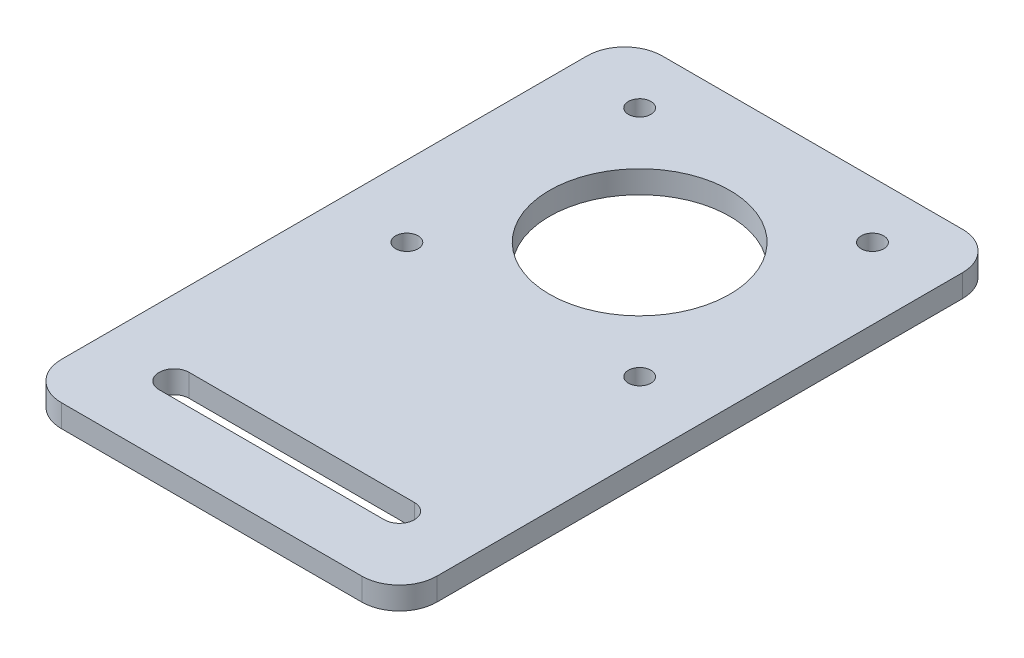
ISO-10303-21;
HEADER;
FILE_DESCRIPTION(('STEP AP214'),'2;1');
FILE_NAME('part.step','',(''),(''),'','','');
FILE_SCHEMA(('AUTOMOTIVE_DESIGN { 1 0 10303 214 1 1 1 1 }'));
ENDSEC;
DATA;
#1=APPLICATION_CONTEXT('core data for automotive mechanical design processes');
#2=APPLICATION_PROTOCOL_DEFINITION('international standard','automotive_design',2000,#1);
#3=PRODUCT_CONTEXT('',#1,'mechanical');
#4=PRODUCT('Part','Part','',(#3));
#5=PRODUCT_RELATED_PRODUCT_CATEGORY('part','',(#4));
#6=PRODUCT_DEFINITION_FORMATION('','',#4);
#7=PRODUCT_DEFINITION_CONTEXT('part definition',#1,'design');
#8=PRODUCT_DEFINITION('design','',#6,#7);
#9=PRODUCT_DEFINITION_SHAPE('','',#8);
#10=(LENGTH_UNIT() NAMED_UNIT(*) SI_UNIT(.MILLI.,.METRE.));
#11=(NAMED_UNIT(*) PLANE_ANGLE_UNIT() SI_UNIT($,.RADIAN.));
#12=(NAMED_UNIT(*) SI_UNIT($,.STERADIAN.) SOLID_ANGLE_UNIT());
#13=UNCERTAINTY_MEASURE_WITH_UNIT(LENGTH_MEASURE(1.E-05),#10,'distance_accuracy_value','');
#14=(GEOMETRIC_REPRESENTATION_CONTEXT(3) GLOBAL_UNCERTAINTY_ASSIGNED_CONTEXT((#13)) GLOBAL_UNIT_ASSIGNED_CONTEXT((#10,
#11,#12)) REPRESENTATION_CONTEXT('',''));
#15=CARTESIAN_POINT('',(0.,0.,0.));
#16=DIRECTION('',(0.,0.,1.));
#17=DIRECTION('',(1.,0.,0.));
#18=AXIS2_PLACEMENT_3D('',#15,#16,#17);
#19=CARTESIAN_POINT('',(-25.,3.,-40.));
#20=DIRECTION('',(1.,0.,0.));
#21=DIRECTION('',(0.,0.,-1.));
#22=AXIS2_PLACEMENT_3D('',#19,#20,#21);
#23=PLANE('',#22);
#24=DIRECTION('',(0.,0.,1.));
#25=VECTOR('',#24,1.);
#26=CARTESIAN_POINT('',(-25.,0.,-40.));
#27=LINE('',#26,#25);
#28=CARTESIAN_POINT('',(-25.,0.,-35.));
#29=VERTEX_POINT('',#28);
#30=CARTESIAN_POINT('',(-25.,0.,35.));
#31=VERTEX_POINT('',#30);
#32=EDGE_CURVE('E163',#29,#31,#27,.T.);
#33=ORIENTED_EDGE('',*,*,#32,.T.);
#34=DIRECTION('',(0.,-1.,0.));
#35=VECTOR('',#34,1.);
#36=CARTESIAN_POINT('',(-25.,3.,35.));
#37=LINE('',#36,#35);
#38=CARTESIAN_POINT('',(-25.,3.,35.));
#39=VERTEX_POINT('',#38);
#40=EDGE_CURVE('E244',#31,#39,#37,.F.);
#41=ORIENTED_EDGE('',*,*,#40,.T.);
#42=DIRECTION('',(0.,0.,1.));
#43=VECTOR('',#42,1.);
#44=CARTESIAN_POINT('',(-25.,3.,-40.));
#45=LINE('',#44,#43);
#46=CARTESIAN_POINT('',(-25.,3.,-35.));
#47=VERTEX_POINT('',#46);
#48=EDGE_CURVE('E196',#47,#39,#45,.T.);
#49=ORIENTED_EDGE('',*,*,#48,.F.);
#50=DIRECTION('',(0.,-1.,0.));
#51=VECTOR('',#50,1.);
#52=CARTESIAN_POINT('',(-25.,3.,-35.));
#53=LINE('',#52,#51);
#54=EDGE_CURVE('E241',#47,#29,#53,.T.);
#55=ORIENTED_EDGE('',*,*,#54,.T.);
#56=EDGE_LOOP('',(#33,#41,#49,#55));
#57=FACE_BOUND('',#56,.T.);
#58=ADVANCED_FACE('F33',(#57),#23,.F.);
#59=CARTESIAN_POINT('',(25.,3.,40.));
#60=DIRECTION('',(0.,0.,-1.));
#61=DIRECTION('',(-1.,0.,0.));
#62=AXIS2_PLACEMENT_3D('',#59,#60,#61);
#63=PLANE('',#62);
#64=DIRECTION('',(1.,0.,0.));
#65=VECTOR('',#64,1.);
#66=CARTESIAN_POINT('',(25.,0.,40.));
#67=LINE('',#66,#65);
#68=CARTESIAN_POINT('',(-20.,0.,40.));
#69=VERTEX_POINT('',#68);
#70=CARTESIAN_POINT('',(20.,0.,40.));
#71=VERTEX_POINT('',#70);
#72=EDGE_CURVE('E210',#69,#71,#67,.T.);
#73=ORIENTED_EDGE('',*,*,#72,.T.);
#74=DIRECTION('',(0.,-1.,0.));
#75=VECTOR('',#74,1.);
#76=CARTESIAN_POINT('',(20.,3.,40.));
#77=LINE('',#76,#75);
#78=CARTESIAN_POINT('',(20.,3.,40.));
#79=VERTEX_POINT('',#78);
#80=EDGE_CURVE('E232',#71,#79,#77,.F.);
#81=ORIENTED_EDGE('',*,*,#80,.T.);
#82=DIRECTION('',(1.,0.,0.));
#83=VECTOR('',#82,1.);
#84=CARTESIAN_POINT('',(25.,3.,40.));
#85=LINE('',#84,#83);
#86=CARTESIAN_POINT('',(-20.,3.,40.));
#87=VERTEX_POINT('',#86);
#88=EDGE_CURVE('E199',#87,#79,#85,.T.);
#89=ORIENTED_EDGE('',*,*,#88,.F.);
#90=DIRECTION('',(0.,-1.,0.));
#91=VECTOR('',#90,1.);
#92=CARTESIAN_POINT('',(-20.,3.,40.));
#93=LINE('',#92,#91);
#94=EDGE_CURVE('E229',#87,#69,#93,.T.);
#95=ORIENTED_EDGE('',*,*,#94,.T.);
#96=EDGE_LOOP('',(#73,#81,#89,#95));
#97=FACE_BOUND('',#96,.T.);
#98=ADVANCED_FACE('F268',(#97),#63,.F.);
#99=CARTESIAN_POINT('',(25.,3.,-40.));
#100=DIRECTION('',(-1.,0.,0.));
#101=DIRECTION('',(0.,0.,1.));
#102=AXIS2_PLACEMENT_3D('',#99,#100,#101);
#103=PLANE('',#102);
#104=DIRECTION('',(0.,0.,-1.));
#105=VECTOR('',#104,1.);
#106=CARTESIAN_POINT('',(25.,3.,-40.));
#107=LINE('',#106,#105);
#108=CARTESIAN_POINT('',(25.,3.,35.));
#109=VERTEX_POINT('',#108);
#110=CARTESIAN_POINT('',(25.,3.,-35.));
#111=VERTEX_POINT('',#110);
#112=EDGE_CURVE('E203',#109,#111,#107,.T.);
#113=ORIENTED_EDGE('',*,*,#112,.F.);
#114=DIRECTION('',(0.,-1.,0.));
#115=VECTOR('',#114,1.);
#116=CARTESIAN_POINT('',(25.,3.,35.));
#117=LINE('',#116,#115);
#118=CARTESIAN_POINT('',(25.,0.,35.));
#119=VERTEX_POINT('',#118);
#120=EDGE_CURVE('E218',#109,#119,#117,.T.);
#121=ORIENTED_EDGE('',*,*,#120,.T.);
#122=DIRECTION('',(0.,0.,-1.));
#123=VECTOR('',#122,1.);
#124=CARTESIAN_POINT('',(25.,0.,-40.));
#125=LINE('',#124,#123);
#126=CARTESIAN_POINT('',(25.,0.,-35.));
#127=VERTEX_POINT('',#126);
#128=EDGE_CURVE('E213',#119,#127,#125,.T.);
#129=ORIENTED_EDGE('',*,*,#128,.T.);
#130=DIRECTION('',(0.,-1.,0.));
#131=VECTOR('',#130,1.);
#132=CARTESIAN_POINT('',(25.,3.,-35.));
#133=LINE('',#132,#131);
#134=EDGE_CURVE('E207',#127,#111,#133,.F.);
#135=ORIENTED_EDGE('',*,*,#134,.T.);
#136=EDGE_LOOP('',(#113,#121,#129,#135));
#137=FACE_BOUND('',#136,.T.);
#138=ADVANCED_FACE('F276',(#137),#103,.F.);
#139=CARTESIAN_POINT('',(25.,3.,-40.));
#140=DIRECTION('',(0.,0.,1.));
#141=DIRECTION('',(1.,0.,0.));
#142=AXIS2_PLACEMENT_3D('',#139,#140,#141);
#143=PLANE('',#142);
#144=DIRECTION('',(-1.,0.,0.));
#145=VECTOR('',#144,1.);
#146=CARTESIAN_POINT('',(25.,0.,-40.));
#147=LINE('',#146,#145);
#148=CARTESIAN_POINT('',(20.,0.,-40.));
#149=VERTEX_POINT('',#148);
#150=CARTESIAN_POINT('',(-20.,0.,-40.));
#151=VERTEX_POINT('',#150);
#152=EDGE_CURVE('E200',#149,#151,#147,.T.);
#153=ORIENTED_EDGE('',*,*,#152,.T.);
#154=DIRECTION('',(0.,-1.,0.));
#155=VECTOR('',#154,1.);
#156=CARTESIAN_POINT('',(-20.,3.,-40.));
#157=LINE('',#156,#155);
#158=CARTESIAN_POINT('',(-20.,3.,-40.));
#159=VERTEX_POINT('',#158);
#160=EDGE_CURVE('E11',#151,#159,#157,.F.);
#161=ORIENTED_EDGE('',*,*,#160,.T.);
#162=DIRECTION('',(-1.,0.,0.));
#163=VECTOR('',#162,1.);
#164=CARTESIAN_POINT('',(25.,3.,-40.));
#165=LINE('',#164,#163);
#166=CARTESIAN_POINT('',(20.,3.,-40.));
#167=VERTEX_POINT('',#166);
#168=EDGE_CURVE('E205',#167,#159,#165,.T.);
#169=ORIENTED_EDGE('',*,*,#168,.F.);
#170=DIRECTION('',(0.,-1.,0.));
#171=VECTOR('',#170,1.);
#172=CARTESIAN_POINT('',(20.,3.,-40.));
#173=LINE('',#172,#171);
#174=EDGE_CURVE('E41',#167,#149,#173,.T.);
#175=ORIENTED_EDGE('',*,*,#174,.T.);
#176=EDGE_LOOP('',(#153,#161,#169,#175));
#177=FACE_BOUND('',#176,.T.);
#178=ADVANCED_FACE('F248',(#177),#143,.F.);
#179=CARTESIAN_POINT('',(0.,3.,0.));
#180=DIRECTION('',(0.,-1.,0.));
#181=DIRECTION('',(0.,0.,-1.));
#182=AXIS2_PLACEMENT_3D('',#179,#180,#181);
#183=PLANE('',#182);
#184=DIRECTION('',(1.,0.,0.));
#185=VECTOR('',#184,1.);
#186=CARTESIAN_POINT('',(-15.0000000000099,3.,32.));
#187=LINE('',#186,#185);
#188=CARTESIAN_POINT('',(-15.0000000000099,3.,32.));
#189=VERTEX_POINT('',#188);
#190=CARTESIAN_POINT('',(15.0000000000099,3.,32.));
#191=VERTEX_POINT('',#190);
#192=EDGE_CURVE('E156',#189,#191,#187,.T.);
#193=ORIENTED_EDGE('',*,*,#192,.F.);
#194=CARTESIAN_POINT('',(-15.0000000000099,3.,30.));
#195=DIRECTION('',(0.,1.,0.));
#196=DIRECTION('',(0.,0.,1.));
#197=AXIS2_PLACEMENT_3D('',#194,#195,#196);
#198=CIRCLE('',#197,2.);
#199=CARTESIAN_POINT('',(-15.0000000000099,3.,28.));
#200=VERTEX_POINT('',#199);
#201=EDGE_CURVE('E129',#200,#189,#198,.T.);
#202=ORIENTED_EDGE('',*,*,#201,.F.);
#203=DIRECTION('',(-1.,0.,0.));
#204=VECTOR('',#203,1.);
#205=CARTESIAN_POINT('',(-15.0000000000099,3.,28.));
#206=LINE('',#205,#204);
#207=CARTESIAN_POINT('',(15.,3.,28.));
#208=VERTEX_POINT('',#207);
#209=EDGE_CURVE('E147',#208,#200,#206,.T.);
#210=ORIENTED_EDGE('',*,*,#209,.F.);
#211=CARTESIAN_POINT('',(15.0000000000099,3.,30.));
#212=DIRECTION('',(0.,1.,0.));
#213=DIRECTION('',(0.,0.,1.));
#214=AXIS2_PLACEMENT_3D('',#211,#212,#213);
#215=CIRCLE('',#214,2.00000000000001);
#216=EDGE_CURVE('E150',#191,#208,#215,.T.);
#217=ORIENTED_EDGE('',*,*,#216,.F.);
#218=EDGE_LOOP('',(#193,#202,#210,#217));
#219=FACE_BOUND('',#218,.T.);
#220=CARTESIAN_POINT('',(0.,3.,-17.));
#221=DIRECTION('',(0.,1.,0.));
#222=DIRECTION('',(0.,0.,1.));
#223=AXIS2_PLACEMENT_3D('',#220,#221,#222);
#224=CIRCLE('',#223,12.);
#225=CARTESIAN_POINT('',(0.,3.,-5.));
#226=VERTEX_POINT('',#225);
#227=EDGE_CURVE('E171',#226,#226,#224,.T.);
#228=ORIENTED_EDGE('',*,*,#227,.F.);
#229=EDGE_LOOP('',(#228));
#230=FACE_BOUND('',#229,.T.);
#231=CARTESIAN_POINT('',(15.5,3.,-1.5));
#232=DIRECTION('',(0.,1.,0.));
#233=DIRECTION('',(0.,0.,1.));
#234=AXIS2_PLACEMENT_3D('',#231,#232,#233);
#235=CIRCLE('',#234,1.5);
#236=CARTESIAN_POINT('',(15.5,3.,0.));
#237=VERTEX_POINT('',#236);
#238=EDGE_CURVE('E170',#237,#237,#235,.T.);
#239=ORIENTED_EDGE('',*,*,#238,.F.);
#240=EDGE_LOOP('',(#239));
#241=FACE_BOUND('',#240,.T.);
#242=CARTESIAN_POINT('',(15.5,3.,-32.5));
#243=DIRECTION('',(0.,1.,0.));
#244=DIRECTION('',(0.,0.,1.));
#245=AXIS2_PLACEMENT_3D('',#242,#243,#244);
#246=CIRCLE('',#245,1.5);
#247=CARTESIAN_POINT('',(15.5,3.,-31.));
#248=VERTEX_POINT('',#247);
#249=EDGE_CURVE('E188',#248,#248,#246,.T.);
#250=ORIENTED_EDGE('',*,*,#249,.F.);
#251=EDGE_LOOP('',(#250));
#252=FACE_BOUND('',#251,.T.);
#253=CARTESIAN_POINT('',(-15.5,3.,-1.5));
#254=DIRECTION('',(0.,1.,0.));
#255=DIRECTION('',(0.,0.,1.));
#256=AXIS2_PLACEMENT_3D('',#253,#254,#255);
#257=CIRCLE('',#256,1.5);
#258=CARTESIAN_POINT('',(-15.5,3.,0.));
#259=VERTEX_POINT('',#258);
#260=EDGE_CURVE('E182',#259,#259,#257,.T.);
#261=ORIENTED_EDGE('',*,*,#260,.F.);
#262=EDGE_LOOP('',(#261));
#263=FACE_BOUND('',#262,.T.);
#264=CARTESIAN_POINT('',(-15.5,3.,-32.5));
#265=DIRECTION('',(0.,1.,0.));
#266=DIRECTION('',(0.,0.,1.));
#267=AXIS2_PLACEMENT_3D('',#264,#265,#266);
#268=CIRCLE('',#267,1.5);
#269=CARTESIAN_POINT('',(-15.5,3.,-31.));
#270=VERTEX_POINT('',#269);
#271=EDGE_CURVE('E176',#270,#270,#268,.T.);
#272=ORIENTED_EDGE('',*,*,#271,.F.);
#273=EDGE_LOOP('',(#272));
#274=FACE_BOUND('',#273,.T.);
#275=ORIENTED_EDGE('',*,*,#88,.T.);
#276=CARTESIAN_POINT('',(20.,3.,35.));
#277=DIRECTION('',(0.,-1.,0.));
#278=DIRECTION('',(0.,0.,-1.));
#279=AXIS2_PLACEMENT_3D('',#276,#277,#278);
#280=CIRCLE('',#279,5.);
#281=EDGE_CURVE('E239',#79,#109,#280,.F.);
#282=ORIENTED_EDGE('',*,*,#281,.T.);
#283=ORIENTED_EDGE('',*,*,#112,.T.);
#284=CARTESIAN_POINT('',(20.,3.,-35.));
#285=DIRECTION('',(0.,-1.,0.));
#286=DIRECTION('',(0.,0.,-1.));
#287=AXIS2_PLACEMENT_3D('',#284,#285,#286);
#288=CIRCLE('',#287,5.);
#289=EDGE_CURVE('E53',#111,#167,#288,.F.);
#290=ORIENTED_EDGE('',*,*,#289,.T.);
#291=ORIENTED_EDGE('',*,*,#168,.T.);
#292=CARTESIAN_POINT('',(-20.,3.,-35.));
#293=DIRECTION('',(0.,-1.,0.));
#294=DIRECTION('',(0.,0.,-1.));
#295=AXIS2_PLACEMENT_3D('',#292,#293,#294);
#296=CIRCLE('',#295,5.);
#297=EDGE_CURVE('E235',#159,#47,#296,.F.);
#298=ORIENTED_EDGE('',*,*,#297,.T.);
#299=ORIENTED_EDGE('',*,*,#48,.T.);
#300=CARTESIAN_POINT('',(-20.,3.,35.));
#301=DIRECTION('',(0.,-1.,0.));
#302=DIRECTION('',(0.,0.,-1.));
#303=AXIS2_PLACEMENT_3D('',#300,#301,#302);
#304=CIRCLE('',#303,5.);
#305=EDGE_CURVE('E237',#39,#87,#304,.F.);
#306=ORIENTED_EDGE('',*,*,#305,.T.);
#307=EDGE_LOOP('',(#275,#282,#283,#290,#291,#298,#299,#306));
#308=FACE_BOUND('',#307,.T.);
#309=ADVANCED_FACE('F261',(#219,#230,#241,#252,#263,#274,#308),#183,.F.);
#310=CARTESIAN_POINT('',(0.,0.,0.));
#311=DIRECTION('',(0.,-1.,0.));
#312=DIRECTION('',(0.,0.,-1.));
#313=AXIS2_PLACEMENT_3D('',#310,#311,#312);
#314=PLANE('',#313);
#315=CARTESIAN_POINT('',(-15.0000000000099,0.,30.));
#316=DIRECTION('',(0.,1.,0.));
#317=DIRECTION('',(0.,0.,1.));
#318=AXIS2_PLACEMENT_3D('',#315,#316,#317);
#319=CIRCLE('',#318,2.);
#320=CARTESIAN_POINT('',(-15.0000000000099,0.,28.));
#321=VERTEX_POINT('',#320);
#322=CARTESIAN_POINT('',(-15.0000000000099,0.,32.));
#323=VERTEX_POINT('',#322);
#324=EDGE_CURVE('E126',#321,#323,#319,.T.);
#325=ORIENTED_EDGE('',*,*,#324,.T.);
#326=DIRECTION('',(1.,0.,0.));
#327=VECTOR('',#326,1.);
#328=CARTESIAN_POINT('',(-15.0000000000099,0.,32.));
#329=LINE('',#328,#327);
#330=CARTESIAN_POINT('',(15.0000000000099,0.,32.));
#331=VERTEX_POINT('',#330);
#332=EDGE_CURVE('E138',#323,#331,#329,.T.);
#333=ORIENTED_EDGE('',*,*,#332,.T.);
#334=CARTESIAN_POINT('',(15.0000000000099,0.,30.));
#335=DIRECTION('',(0.,1.,0.));
#336=DIRECTION('',(0.,0.,1.));
#337=AXIS2_PLACEMENT_3D('',#334,#335,#336);
#338=CIRCLE('',#337,2.00000000000001);
#339=CARTESIAN_POINT('',(15.,0.,28.));
#340=VERTEX_POINT('',#339);
#341=EDGE_CURVE('E142',#331,#340,#338,.T.);
#342=ORIENTED_EDGE('',*,*,#341,.T.);
#343=DIRECTION('',(-1.,0.,0.));
#344=VECTOR('',#343,1.);
#345=CARTESIAN_POINT('',(-15.0000000000099,0.,28.));
#346=LINE('',#345,#344);
#347=EDGE_CURVE('E134',#340,#321,#346,.T.);
#348=ORIENTED_EDGE('',*,*,#347,.T.);
#349=EDGE_LOOP('',(#325,#333,#342,#348));
#350=FACE_BOUND('',#349,.T.);
#351=CARTESIAN_POINT('',(0.,0.,-17.));
#352=DIRECTION('',(0.,1.,0.));
#353=DIRECTION('',(0.,0.,1.));
#354=AXIS2_PLACEMENT_3D('',#351,#352,#353);
#355=CIRCLE('',#354,12.);
#356=CARTESIAN_POINT('',(0.,0.,-5.));
#357=VERTEX_POINT('',#356);
#358=EDGE_CURVE('E167',#357,#357,#355,.T.);
#359=ORIENTED_EDGE('',*,*,#358,.T.);
#360=EDGE_LOOP('',(#359));
#361=FACE_BOUND('',#360,.T.);
#362=CARTESIAN_POINT('',(15.5,0.,-1.5));
#363=DIRECTION('',(0.,1.,0.));
#364=DIRECTION('',(0.,0.,1.));
#365=AXIS2_PLACEMENT_3D('',#362,#363,#364);
#366=CIRCLE('',#365,1.5);
#367=CARTESIAN_POINT('',(15.5,0.,0.));
#368=VERTEX_POINT('',#367);
#369=EDGE_CURVE('E191',#368,#368,#366,.T.);
#370=ORIENTED_EDGE('',*,*,#369,.T.);
#371=EDGE_LOOP('',(#370));
#372=FACE_BOUND('',#371,.T.);
#373=CARTESIAN_POINT('',(15.5,0.,-32.5));
#374=DIRECTION('',(0.,1.,0.));
#375=DIRECTION('',(0.,0.,1.));
#376=AXIS2_PLACEMENT_3D('',#373,#374,#375);
#377=CIRCLE('',#376,1.5);
#378=CARTESIAN_POINT('',(15.5,0.,-31.));
#379=VERTEX_POINT('',#378);
#380=EDGE_CURVE('E185',#379,#379,#377,.T.);
#381=ORIENTED_EDGE('',*,*,#380,.T.);
#382=EDGE_LOOP('',(#381));
#383=FACE_BOUND('',#382,.T.);
#384=CARTESIAN_POINT('',(-15.5,0.,-1.5));
#385=DIRECTION('',(0.,1.,0.));
#386=DIRECTION('',(0.,0.,1.));
#387=AXIS2_PLACEMENT_3D('',#384,#385,#386);
#388=CIRCLE('',#387,1.5);
#389=CARTESIAN_POINT('',(-15.5,0.,0.));
#390=VERTEX_POINT('',#389);
#391=EDGE_CURVE('E179',#390,#390,#388,.T.);
#392=ORIENTED_EDGE('',*,*,#391,.T.);
#393=EDGE_LOOP('',(#392));
#394=FACE_BOUND('',#393,.T.);
#395=CARTESIAN_POINT('',(-15.5,0.,-32.5));
#396=DIRECTION('',(0.,1.,0.));
#397=DIRECTION('',(0.,0.,1.));
#398=AXIS2_PLACEMENT_3D('',#395,#396,#397);
#399=CIRCLE('',#398,1.5);
#400=CARTESIAN_POINT('',(-15.5,0.,-31.));
#401=VERTEX_POINT('',#400);
#402=EDGE_CURVE('E157',#401,#401,#399,.T.);
#403=ORIENTED_EDGE('',*,*,#402,.T.);
#404=EDGE_LOOP('',(#403));
#405=FACE_BOUND('',#404,.T.);
#406=ORIENTED_EDGE('',*,*,#128,.F.);
#407=CARTESIAN_POINT('',(20.,0.,35.));
#408=DIRECTION('',(0.,-1.,0.));
#409=DIRECTION('',(0.,0.,-1.));
#410=AXIS2_PLACEMENT_3D('',#407,#408,#409);
#411=CIRCLE('',#410,5.);
#412=EDGE_CURVE('E227',#119,#71,#411,.T.);
#413=ORIENTED_EDGE('',*,*,#412,.T.);
#414=ORIENTED_EDGE('',*,*,#72,.F.);
#415=CARTESIAN_POINT('',(-20.,0.,35.));
#416=DIRECTION('',(0.,-1.,0.));
#417=DIRECTION('',(0.,0.,-1.));
#418=AXIS2_PLACEMENT_3D('',#415,#416,#417);
#419=CIRCLE('',#418,5.);
#420=EDGE_CURVE('E225',#69,#31,#419,.T.);
#421=ORIENTED_EDGE('',*,*,#420,.T.);
#422=ORIENTED_EDGE('',*,*,#32,.F.);
#423=CARTESIAN_POINT('',(-20.,0.,-35.));
#424=DIRECTION('',(0.,-1.,0.));
#425=DIRECTION('',(0.,0.,-1.));
#426=AXIS2_PLACEMENT_3D('',#423,#424,#425);
#427=CIRCLE('',#426,5.);
#428=EDGE_CURVE('E223',#29,#151,#427,.T.);
#429=ORIENTED_EDGE('',*,*,#428,.T.);
#430=ORIENTED_EDGE('',*,*,#152,.F.);
#431=CARTESIAN_POINT('',(20.,0.,-35.));
#432=DIRECTION('',(0.,-1.,0.));
#433=DIRECTION('',(0.,0.,-1.));
#434=AXIS2_PLACEMENT_3D('',#431,#432,#433);
#435=CIRCLE('',#434,5.);
#436=EDGE_CURVE('E221',#149,#127,#435,.T.);
#437=ORIENTED_EDGE('',*,*,#436,.T.);
#438=EDGE_LOOP('',(#406,#413,#414,#421,#422,#429,#430,#437));
#439=FACE_BOUND('',#438,.T.);
#440=ADVANCED_FACE('F144',(#350,#361,#372,#383,#394,#405,#439),#314,.T.);
#441=CARTESIAN_POINT('',(-15.5,0.,-32.5));
#442=DIRECTION('',(0.,1.,0.));
#443=DIRECTION('',(0.,0.,1.));
#444=AXIS2_PLACEMENT_3D('',#441,#442,#443);
#445=CYLINDRICAL_SURFACE('',#444,1.5);
#446=ORIENTED_EDGE('',*,*,#402,.F.);
#447=EDGE_LOOP('',(#446));
#448=FACE_BOUND('',#447,.T.);
#449=ORIENTED_EDGE('',*,*,#271,.T.);
#450=EDGE_LOOP('',(#449));
#451=FACE_BOUND('',#450,.T.);
#452=ADVANCED_FACE('F382',(#448,#451),#445,.F.);
#453=CARTESIAN_POINT('',(-15.5,0.,-1.5));
#454=DIRECTION('',(0.,1.,0.));
#455=DIRECTION('',(0.,0.,1.));
#456=AXIS2_PLACEMENT_3D('',#453,#454,#455);
#457=CYLINDRICAL_SURFACE('',#456,1.5);
#458=ORIENTED_EDGE('',*,*,#391,.F.);
#459=EDGE_LOOP('',(#458));
#460=FACE_BOUND('',#459,.T.);
#461=ORIENTED_EDGE('',*,*,#260,.T.);
#462=EDGE_LOOP('',(#461));
#463=FACE_BOUND('',#462,.T.);
#464=ADVANCED_FACE('F373',(#460,#463),#457,.F.);
#465=CARTESIAN_POINT('',(15.5,0.,-32.5));
#466=DIRECTION('',(0.,1.,0.));
#467=DIRECTION('',(0.,0.,1.));
#468=AXIS2_PLACEMENT_3D('',#465,#466,#467);
#469=CYLINDRICAL_SURFACE('',#468,1.5);
#470=ORIENTED_EDGE('',*,*,#380,.F.);
#471=EDGE_LOOP('',(#470));
#472=FACE_BOUND('',#471,.T.);
#473=ORIENTED_EDGE('',*,*,#249,.T.);
#474=EDGE_LOOP('',(#473));
#475=FACE_BOUND('',#474,.T.);
#476=ADVANCED_FACE('F364',(#472,#475),#469,.F.);
#477=CARTESIAN_POINT('',(15.5,0.,-1.5));
#478=DIRECTION('',(0.,1.,0.));
#479=DIRECTION('',(0.,0.,1.));
#480=AXIS2_PLACEMENT_3D('',#477,#478,#479);
#481=CYLINDRICAL_SURFACE('',#480,1.5);
#482=ORIENTED_EDGE('',*,*,#369,.F.);
#483=EDGE_LOOP('',(#482));
#484=FACE_BOUND('',#483,.T.);
#485=ORIENTED_EDGE('',*,*,#238,.T.);
#486=EDGE_LOOP('',(#485));
#487=FACE_BOUND('',#486,.T.);
#488=ADVANCED_FACE('F355',(#484,#487),#481,.F.);
#489=CARTESIAN_POINT('',(0.,0.,-17.));
#490=DIRECTION('',(0.,1.,0.));
#491=DIRECTION('',(0.,0.,1.));
#492=AXIS2_PLACEMENT_3D('',#489,#490,#491);
#493=CYLINDRICAL_SURFACE('',#492,12.);
#494=ORIENTED_EDGE('',*,*,#358,.F.);
#495=EDGE_LOOP('',(#494));
#496=FACE_BOUND('',#495,.T.);
#497=ORIENTED_EDGE('',*,*,#227,.T.);
#498=EDGE_LOOP('',(#497));
#499=FACE_BOUND('',#498,.T.);
#500=ADVANCED_FACE('F347',(#496,#499),#493,.F.);
#501=CARTESIAN_POINT('',(-15.0000000000099,0.,30.));
#502=DIRECTION('',(0.,1.,0.));
#503=DIRECTION('',(0.,0.,1.));
#504=AXIS2_PLACEMENT_3D('',#501,#502,#503);
#505=CYLINDRICAL_SURFACE('',#504,2.);
#506=ORIENTED_EDGE('',*,*,#201,.T.);
#507=DIRECTION('',(0.,1.,0.));
#508=VECTOR('',#507,1.);
#509=CARTESIAN_POINT('',(-15.0000000000099,0.,32.));
#510=LINE('',#509,#508);
#511=EDGE_CURVE('E122',#323,#189,#510,.T.);
#512=ORIENTED_EDGE('',*,*,#511,.F.);
#513=ORIENTED_EDGE('',*,*,#324,.F.);
#514=DIRECTION('',(0.,1.,0.));
#515=VECTOR('',#514,1.);
#516=CARTESIAN_POINT('',(-15.0000000000099,0.,28.));
#517=LINE('',#516,#515);
#518=EDGE_CURVE('E161',#321,#200,#517,.T.);
#519=ORIENTED_EDGE('',*,*,#518,.T.);
#520=EDGE_LOOP('',(#506,#512,#513,#519));
#521=FACE_BOUND('',#520,.T.);
#522=ADVANCED_FACE('F124',(#521),#505,.F.);
#523=CARTESIAN_POINT('',(-15.0000000000099,0.,28.));
#524=DIRECTION('',(0.,0.,-1.));
#525=DIRECTION('',(-1.,0.,0.));
#526=AXIS2_PLACEMENT_3D('',#523,#524,#525);
#527=PLANE('',#526);
#528=ORIENTED_EDGE('',*,*,#209,.T.);
#529=ORIENTED_EDGE('',*,*,#518,.F.);
#530=ORIENTED_EDGE('',*,*,#347,.F.);
#531=DIRECTION('',(0.,1.,0.));
#532=VECTOR('',#531,1.);
#533=CARTESIAN_POINT('',(15.,0.,28.));
#534=LINE('',#533,#532);
#535=EDGE_CURVE('E164',#340,#208,#534,.T.);
#536=ORIENTED_EDGE('',*,*,#535,.T.);
#537=EDGE_LOOP('',(#528,#529,#530,#536));
#538=FACE_BOUND('',#537,.T.);
#539=ADVANCED_FACE('F330',(#538),#527,.F.);
#540=CARTESIAN_POINT('',(15.0000000000099,0.,30.));
#541=DIRECTION('',(0.,1.,0.));
#542=DIRECTION('',(0.,0.,1.));
#543=AXIS2_PLACEMENT_3D('',#540,#541,#542);
#544=CYLINDRICAL_SURFACE('',#543,2.00000000000001);
#545=ORIENTED_EDGE('',*,*,#216,.T.);
#546=ORIENTED_EDGE('',*,*,#535,.F.);
#547=ORIENTED_EDGE('',*,*,#341,.F.);
#548=DIRECTION('',(0.,1.,0.));
#549=VECTOR('',#548,1.);
#550=CARTESIAN_POINT('',(15.0000000000099,0.,32.));
#551=LINE('',#550,#549);
#552=EDGE_CURVE('E133',#331,#191,#551,.T.);
#553=ORIENTED_EDGE('',*,*,#552,.T.);
#554=EDGE_LOOP('',(#545,#546,#547,#553));
#555=FACE_BOUND('',#554,.T.);
#556=ADVANCED_FACE('F322',(#555),#544,.F.);
#557=CARTESIAN_POINT('',(-15.0000000000099,0.,32.));
#558=DIRECTION('',(0.,0.,1.));
#559=DIRECTION('',(1.,0.,0.));
#560=AXIS2_PLACEMENT_3D('',#557,#558,#559);
#561=PLANE('',#560);
#562=ORIENTED_EDGE('',*,*,#192,.T.);
#563=ORIENTED_EDGE('',*,*,#552,.F.);
#564=ORIENTED_EDGE('',*,*,#332,.F.);
#565=ORIENTED_EDGE('',*,*,#511,.T.);
#566=EDGE_LOOP('',(#562,#563,#564,#565));
#567=FACE_BOUND('',#566,.T.);
#568=ADVANCED_FACE('F139',(#567),#561,.F.);
#569=CARTESIAN_POINT('',(20.,3.,35.));
#570=DIRECTION('',(0.,-1.,0.));
#571=DIRECTION('',(0.,0.,-1.));
#572=AXIS2_PLACEMENT_3D('',#569,#570,#571);
#573=CYLINDRICAL_SURFACE('',#572,5.);
#574=ORIENTED_EDGE('',*,*,#281,.F.);
#575=ORIENTED_EDGE('',*,*,#80,.F.);
#576=ORIENTED_EDGE('',*,*,#412,.F.);
#577=ORIENTED_EDGE('',*,*,#120,.F.);
#578=EDGE_LOOP('',(#574,#575,#576,#577));
#579=FACE_BOUND('',#578,.T.);
#580=ADVANCED_FACE('F273',(#579),#573,.T.);
#581=CARTESIAN_POINT('',(-20.,3.,35.));
#582=DIRECTION('',(0.,-1.,0.));
#583=DIRECTION('',(0.,0.,-1.));
#584=AXIS2_PLACEMENT_3D('',#581,#582,#583);
#585=CYLINDRICAL_SURFACE('',#584,5.);
#586=ORIENTED_EDGE('',*,*,#305,.F.);
#587=ORIENTED_EDGE('',*,*,#40,.F.);
#588=ORIENTED_EDGE('',*,*,#420,.F.);
#589=ORIENTED_EDGE('',*,*,#94,.F.);
#590=EDGE_LOOP('',(#586,#587,#588,#589));
#591=FACE_BOUND('',#590,.T.);
#592=ADVANCED_FACE('F265',(#591),#585,.T.);
#593=CARTESIAN_POINT('',(-20.,3.,-35.));
#594=DIRECTION('',(0.,-1.,0.));
#595=DIRECTION('',(0.,0.,-1.));
#596=AXIS2_PLACEMENT_3D('',#593,#594,#595);
#597=CYLINDRICAL_SURFACE('',#596,5.);
#598=ORIENTED_EDGE('',*,*,#297,.F.);
#599=ORIENTED_EDGE('',*,*,#160,.F.);
#600=ORIENTED_EDGE('',*,*,#428,.F.);
#601=ORIENTED_EDGE('',*,*,#54,.F.);
#602=EDGE_LOOP('',(#598,#599,#600,#601));
#603=FACE_BOUND('',#602,.T.);
#604=ADVANCED_FACE('F256',(#603),#597,.T.);
#605=CARTESIAN_POINT('',(20.,3.,-35.));
#606=DIRECTION('',(0.,-1.,0.));
#607=DIRECTION('',(0.,0.,-1.));
#608=AXIS2_PLACEMENT_3D('',#605,#606,#607);
#609=CYLINDRICAL_SURFACE('',#608,5.);
#610=ORIENTED_EDGE('',*,*,#289,.F.);
#611=ORIENTED_EDGE('',*,*,#134,.F.);
#612=ORIENTED_EDGE('',*,*,#436,.F.);
#613=ORIENTED_EDGE('',*,*,#174,.F.);
#614=EDGE_LOOP('',(#610,#611,#612,#613));
#615=FACE_BOUND('',#614,.T.);
#616=ADVANCED_FACE('F35',(#615),#609,.T.);
#617=CLOSED_SHELL('',(#58,#98,#138,#178,#309,#440,#452,#464,#476,#488,#500,#522,#539,#556,#568,
#580,#592,#604,#616));
#618=MANIFOLD_SOLID_BREP('B2',#617);
#619=ADVANCED_BREP_SHAPE_REPRESENTATION('',(#18,#618),#14);
#620=SHAPE_DEFINITION_REPRESENTATION(#9,#619);
ENDSEC;
END-ISO-10303-21;
